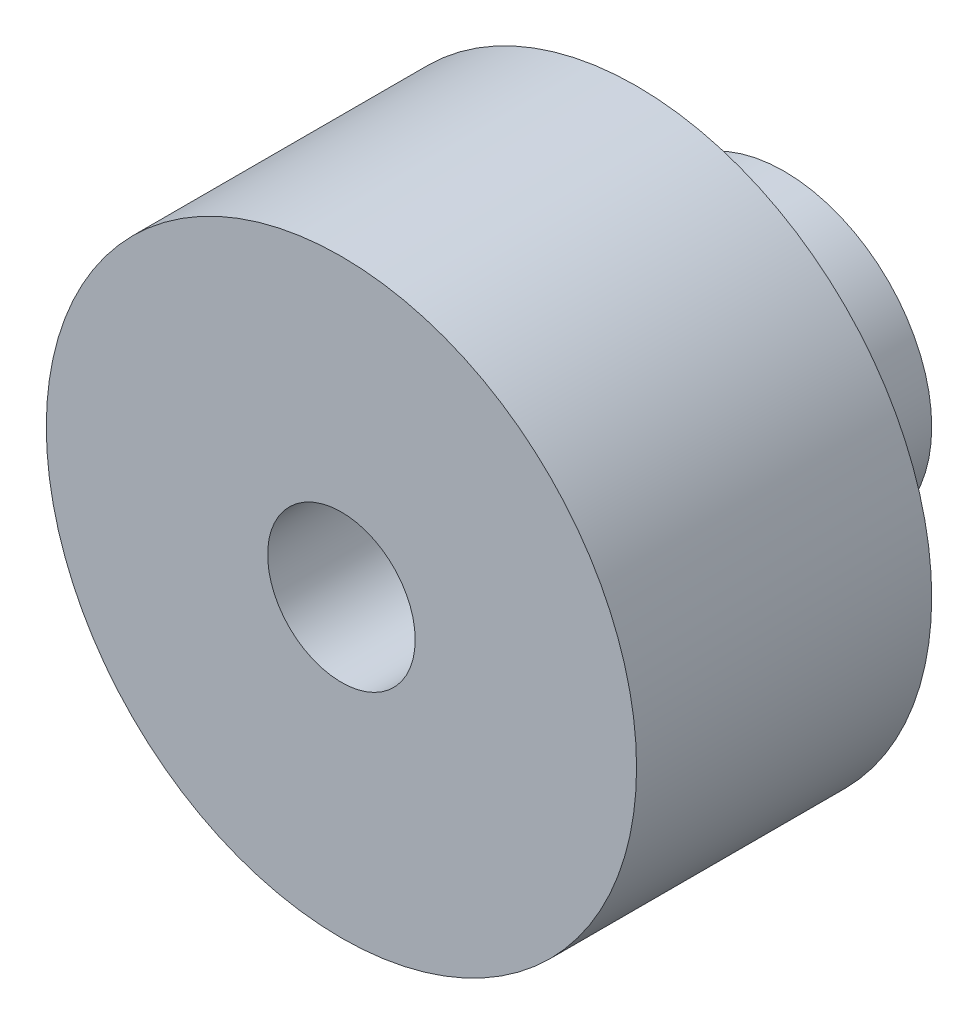
ISO-10303-21;
HEADER;
FILE_DESCRIPTION(('STEP AP214'),'2;1');
FILE_NAME('part.step','',(''),(''),'','','');
FILE_SCHEMA(('AUTOMOTIVE_DESIGN { 1 0 10303 214 1 1 1 1 }'));
ENDSEC;
DATA;
#1=APPLICATION_CONTEXT('core data for automotive mechanical design processes');
#2=APPLICATION_PROTOCOL_DEFINITION('international standard','automotive_design',2000,#1);
#3=PRODUCT_CONTEXT('',#1,'mechanical');
#4=PRODUCT('Part','Part','',(#3));
#5=PRODUCT_RELATED_PRODUCT_CATEGORY('part','',(#4));
#6=PRODUCT_DEFINITION_FORMATION('','',#4);
#7=PRODUCT_DEFINITION_CONTEXT('part definition',#1,'design');
#8=PRODUCT_DEFINITION('design','',#6,#7);
#9=PRODUCT_DEFINITION_SHAPE('','',#8);
#10=(LENGTH_UNIT() NAMED_UNIT(*) SI_UNIT(.MILLI.,.METRE.));
#11=(NAMED_UNIT(*) PLANE_ANGLE_UNIT() SI_UNIT($,.RADIAN.));
#12=(NAMED_UNIT(*) SI_UNIT($,.STERADIAN.) SOLID_ANGLE_UNIT());
#13=UNCERTAINTY_MEASURE_WITH_UNIT(LENGTH_MEASURE(1.E-05),#10,'distance_accuracy_value','');
#14=(GEOMETRIC_REPRESENTATION_CONTEXT(3) GLOBAL_UNCERTAINTY_ASSIGNED_CONTEXT((#13)) GLOBAL_UNIT_ASSIGNED_CONTEXT((#10,
#11,#12)) REPRESENTATION_CONTEXT('',''));
#15=CARTESIAN_POINT('',(0.,0.,0.));
#16=DIRECTION('',(0.,0.,1.));
#17=DIRECTION('',(1.,0.,0.));
#18=AXIS2_PLACEMENT_3D('',#15,#16,#17);
#19=CARTESIAN_POINT('',(0.,0.,0.));
#20=DIRECTION('',(0.,0.,1.));
#21=DIRECTION('',(1.,0.,0.));
#22=AXIS2_PLACEMENT_3D('',#19,#20,#21);
#23=PLANE('',#22);
#24=CARTESIAN_POINT('',(0.,0.,0.));
#25=DIRECTION('',(0.,0.,1.));
#26=DIRECTION('',(1.,0.,0.));
#27=AXIS2_PLACEMENT_3D('',#24,#25,#26);
#28=CIRCLE('',#27,20.);
#29=CARTESIAN_POINT('',(20.,0.,0.));
#30=VERTEX_POINT('',#29);
#31=EDGE_CURVE('E66',#30,#30,#28,.T.);
#32=ORIENTED_EDGE('',*,*,#31,.F.);
#33=EDGE_LOOP('',(#32));
#34=FACE_BOUND('',#33,.T.);
#35=CARTESIAN_POINT('',(0.,0.,0.));
#36=DIRECTION('',(0.,0.,1.));
#37=DIRECTION('',(1.,0.,0.));
#38=AXIS2_PLACEMENT_3D('',#35,#36,#37);
#39=CIRCLE('',#38,10.);
#40=CARTESIAN_POINT('',(10.,0.,0.));
#41=VERTEX_POINT('',#40);
#42=EDGE_CURVE('E56',#41,#41,#39,.F.);
#43=ORIENTED_EDGE('',*,*,#42,.F.);
#44=EDGE_LOOP('',(#43));
#45=FACE_BOUND('',#44,.T.);
#46=ADVANCED_FACE('F43',(#34,#45),#23,.F.);
#47=CARTESIAN_POINT('',(0.,0.,20.));
#48=DIRECTION('',(0.,0.,-1.));
#49=DIRECTION('',(-1.,0.,0.));
#50=AXIS2_PLACEMENT_3D('',#47,#48,#49);
#51=CYLINDRICAL_SURFACE('',#50,20.);
#52=CARTESIAN_POINT('',(0.,0.,20.));
#53=DIRECTION('',(0.,0.,1.));
#54=DIRECTION('',(1.,0.,0.));
#55=AXIS2_PLACEMENT_3D('',#52,#53,#54);
#56=CIRCLE('',#55,20.);
#57=CARTESIAN_POINT('',(20.,0.,20.));
#58=VERTEX_POINT('',#57);
#59=EDGE_CURVE('E61',#58,#58,#56,.T.);
#60=ORIENTED_EDGE('',*,*,#59,.F.);
#61=EDGE_LOOP('',(#60));
#62=FACE_BOUND('',#61,.T.);
#63=ORIENTED_EDGE('',*,*,#31,.T.);
#64=EDGE_LOOP('',(#63));
#65=FACE_BOUND('',#64,.T.);
#66=ADVANCED_FACE('F45',(#62,#65),#51,.T.);
#67=CARTESIAN_POINT('',(0.,0.,20.));
#68=DIRECTION('',(0.,0.,1.));
#69=DIRECTION('',(1.,0.,0.));
#70=AXIS2_PLACEMENT_3D('',#67,#68,#69);
#71=PLANE('',#70);
#72=CARTESIAN_POINT('',(0.,0.,20.));
#73=DIRECTION('',(0.,0.,1.));
#74=DIRECTION('',(1.,0.,0.));
#75=AXIS2_PLACEMENT_3D('',#72,#73,#74);
#76=CIRCLE('',#75,5.);
#77=CARTESIAN_POINT('',(5.,0.,20.));
#78=VERTEX_POINT('',#77);
#79=EDGE_CURVE('E71',#78,#78,#76,.T.);
#80=ORIENTED_EDGE('',*,*,#79,.F.);
#81=EDGE_LOOP('',(#80));
#82=FACE_BOUND('',#81,.T.);
#83=ORIENTED_EDGE('',*,*,#59,.T.);
#84=EDGE_LOOP('',(#83));
#85=FACE_BOUND('',#84,.T.);
#86=ADVANCED_FACE('F108',(#82,#85),#71,.T.);
#87=CARTESIAN_POINT('',(0.,0.,-14.142135623731));
#88=DIRECTION('',(0.,0.,1.));
#89=DIRECTION('',(1.,0.,0.));
#90=AXIS2_PLACEMENT_3D('',#87,#88,#89);
#91=CYLINDRICAL_SURFACE('',#90,5.);
#92=CARTESIAN_POINT('',(5.,0.,-6.));
#93=CARTESIAN_POINT('',(4.99999897580871,-0.0555769067926332,-5.99999795550166));
#94=CARTESIAN_POINT('',(4.99906385178231,-0.111179660201522,-5.99535115703235));
#95=CARTESIAN_POINT('',(4.99542365623231,-0.220813507689019,-5.97690149988475));
#96=CARTESIAN_POINT('',(4.99271717860186,-0.274843317541356,-5.96309136719849));
#97=CARTESIAN_POINT('',(4.98583649278287,-0.379730305263313,-5.92675872637921));
#98=CARTESIAN_POINT('',(4.98166369076718,-0.430590467933134,-5.90424456315531));
#99=CARTESIAN_POINT('',(4.97230398035314,-0.527807988864226,-5.85116775248871));
#100=CARTESIAN_POINT('',(4.96711713235707,-0.574165615075812,-5.82060558439279));
#101=CARTESIAN_POINT('',(4.9562216532997,-0.661693477314865,-5.75186150570857));
#102=CARTESIAN_POINT('',(4.95050745504347,-0.702793951158525,-5.7135916446088));
#103=CARTESIAN_POINT('',(4.93924180452588,-0.778036756608028,-5.6307075836083));
#104=CARTESIAN_POINT('',(4.93369036500424,-0.812178544770425,-5.58609288866488));
#105=CARTESIAN_POINT('',(4.92332441812615,-0.87283175334762,-5.49128380698812));
#106=CARTESIAN_POINT('',(4.91851707364946,-0.899270938865866,-5.44104235620364));
#107=CARTESIAN_POINT('',(4.91026268058418,-0.943305666580308,-5.33671818099592));
#108=CARTESIAN_POINT('',(4.90681549761962,-0.960902082437238,-5.28263583665365));
#109=CARTESIAN_POINT('',(4.90172805252204,-0.986525299884827,-5.17291563609208));
#110=CARTESIAN_POINT('',(4.90006470107188,-0.994674497958777,-5.11730745585777));
#111=CARTESIAN_POINT('',(4.89866375060627,-1.00155212772612,-5.00549017863566));
#112=CARTESIAN_POINT('',(4.89892595467841,-1.0002815227135,-4.94928114367985));
#113=CARTESIAN_POINT('',(4.90132551148185,-0.988454573101819,-4.838753211979));
#114=CARTESIAN_POINT('',(4.90343452858763,-0.978038540243905,-4.78441859437269));
#115=CARTESIAN_POINT('',(4.90924546160001,-0.94843788462305,-4.678283923337));
#116=CARTESIAN_POINT('',(4.91294745357779,-0.929252843100681,-4.62648399108099));
#117=CARTESIAN_POINT('',(4.92155618500408,-0.882524783674719,-4.5264847382964));
#118=CARTESIAN_POINT('',(4.92647089813704,-0.854926151232114,-4.47831212043083));
#119=CARTESIAN_POINT('',(4.93694618773062,-0.792193574572679,-4.38722915002719));
#120=CARTESIAN_POINT('',(4.94250683838366,-0.757058764356829,-4.34431940314884));
#121=CARTESIAN_POINT('',(4.95377021241462,-0.679499934560584,-4.26417059754306));
#122=CARTESIAN_POINT('',(4.95947369210905,-0.636956161212445,-4.22704743214087));
#123=CARTESIAN_POINT('',(4.97028848714408,-0.54618502406201,-4.16044615369878));
#124=CARTESIAN_POINT('',(4.97539979488974,-0.497957587379389,-4.13096813870642));
#125=CARTESIAN_POINT('',(4.98446690160887,-0.397059386878921,-4.08047249077403));
#126=CARTESIAN_POINT('',(4.98842088848272,-0.3443818195853,-4.05946810635546));
#127=CARTESIAN_POINT('',(4.99471408987858,-0.236148976448665,-4.02663952596143));
#128=CARTESIAN_POINT('',(4.99705350000531,-0.18059405007245,-4.01481421792637));
#129=CARTESIAN_POINT('',(4.99982671866868,-0.0691794056271504,-4.00084354620572));
#130=CARTESIAN_POINT('',(5.0002917465247,-0.0133403283255762,-3.99853958045973));
#131=CARTESIAN_POINT('',(4.99935051930103,0.0979249341927141,-4.00324985894218));
#132=CARTESIAN_POINT('',(4.99794436941446,0.153351142443793,-4.0102635793526));
#133=CARTESIAN_POINT('',(4.99343832008018,0.261705659946541,-4.03327837354396));
#134=CARTESIAN_POINT('',(4.99035376404206,0.314651948339903,-4.0491980684979));
#135=CARTESIAN_POINT('',(4.98283552061033,0.417123627499667,-4.08948398265581));
#136=CARTESIAN_POINT('',(4.97840173214227,0.466648761637539,-4.11385083467683));
#137=CARTESIAN_POINT('',(4.96859911533294,0.561541173686218,-4.17068249065131));
#138=CARTESIAN_POINT('',(4.96321950437052,0.606850126752188,-4.20324278103895));
#139=CARTESIAN_POINT('',(4.95214734829882,0.691418019119206,-4.27540919120728));
#140=CARTESIAN_POINT('',(4.94645476968388,0.730676308930762,-4.31501606639987));
#141=CARTESIAN_POINT('',(4.93529303556965,0.802640590774176,-4.40087335189112));
#142=CARTESIAN_POINT('',(4.92982860233304,0.835237702448655,-4.44721574422134));
#143=CARTESIAN_POINT('',(4.91984191796194,0.892185420051205,-4.54481136135668));
#144=CARTESIAN_POINT('',(4.91531962913342,0.916536355922903,-4.59606438957355));
#145=CARTESIAN_POINT('',(4.90776740584383,0.95615184158196,-4.70176824614955));
#146=CARTESIAN_POINT('',(4.90472974872187,0.971463499791051,-4.75620084121032));
#147=CARTESIAN_POINT('',(4.90047436792025,0.992708651627196,-4.86693345349091));
#148=CARTESIAN_POINT('',(4.89925640691111,0.998643368225112,-4.92323322620935));
#149=CARTESIAN_POINT('',(4.89879149631379,1.00092091086747,-5.03500886454432));
#150=CARTESIAN_POINT('',(4.89950919189301,0.997435788070896,-5.09048114892701));
#151=CARTESIAN_POINT('',(4.90275573484614,0.981352304100061,-5.20003164990503));
#152=CARTESIAN_POINT('',(4.90528456767169,0.968754016129298,-5.2541098776948));
#153=CARTESIAN_POINT('',(4.91185264219159,0.934878568498954,-5.35922771124055));
#154=CARTESIAN_POINT('',(4.91588821018831,0.913622506717344,-5.41027436050242));
#155=CARTESIAN_POINT('',(4.9250171497417,0.863054644601604,-5.50810372073444));
#156=CARTESIAN_POINT('',(4.93011060998894,0.833742168774882,-5.55488607372514));
#157=CARTESIAN_POINT('',(4.94088960523225,0.767305914786414,-5.64371557215031));
#158=CARTESIAN_POINT('',(4.94658372909699,0.73005788723518,-5.6856687652676));
#159=CARTESIAN_POINT('',(4.95786081871955,0.64906436901314,-5.76278620552917));
#160=CARTESIAN_POINT('',(4.96344375863184,0.605317387153334,-5.79794889031727));
#161=CARTESIAN_POINT('',(4.97393832387971,0.512017629088246,-5.86083464394645));
#162=CARTESIAN_POINT('',(4.97884231219246,0.462408884429835,-5.88847600328002));
#163=CARTESIAN_POINT('',(4.98735125085,0.359166360940732,-5.93498612259659));
#164=CARTESIAN_POINT('',(4.99095737138616,0.305536260863126,-5.95386278953249));
#165=CARTESIAN_POINT('',(4.99576372595371,0.209821488923779,-5.97865194804472));
#166=CARTESIAN_POINT('',(4.99734303158452,0.168281664013784,-5.98664319370776));
#167=CARTESIAN_POINT('',(4.99946154139893,0.0844995252100669,-5.99731791235836));
#168=CARTESIAN_POINT('',(5.00000077873155,0.042257233748619,-6.00000155450977));
#169=CARTESIAN_POINT('',(5.,0.,-6.));
#170=B_SPLINE_CURVE_WITH_KNOTS('',3,(#92,#93,#94,#95,#96,#97,#98,#99,#100,#101,#102,#103,#104,
#105,#106,#107,#108,#109,#110,#111,#112,#113,#114,#115,#116,#117,#118,#119,#120,#121,#122,#123,
#124,#125,#126,#127,#128,#129,#130,#131,#132,#133,#134,#135,#136,#137,#138,#139,#140,#141,#142,
#143,#144,#145,#146,#147,#148,#149,#150,#151,#152,#153,#154,#155,#156,#157,#158,#159,#160,#161,
#162,#163,#164,#165,#166,#167,#168,#169),.UNSPECIFIED.,.T.,.F.,(4,2,2,2,2,2,2,2,2,2,2,2,2,2,2,2,
2,2,2,2,2,2,2,2,2,2,2,2,2,2,2,2,2,2,2,2,2,2,4),(0.,0.166576130661258,0.333284650691323,
0.499833735250342,0.666372902230863,0.834932670112187,1.00350559674737,1.17361195005923,
1.34370149365197,1.51156185103587,1.67940504281225,1.84471727006278,2.0100373925373,
2.17647490203592,2.3429315474967,2.51238252491351,2.6818356753982,2.85155274854024,
3.02124925698036,3.18810735676265,3.35495607657867,3.52030453950723,3.68566539216022,
3.85305066033358,4.0204538834593,4.19040628579226,4.36035188723466,4.52940381032723,
4.69843368330415,4.86439722567701,5.03035943492608,5.1959196125311,5.36149367581866,
5.52988076239143,5.6983065453293,5.86849496675637,6.03852955517518,6.16518775289894,
6.29184191370996),.UNSPECIFIED.);
#171=CARTESIAN_POINT('',(5.,0.,-6.));
#172=VERTEX_POINT('',#171);
#173=EDGE_CURVE('E84',#172,#172,#170,.T.);
#174=ORIENTED_EDGE('',*,*,#173,.F.);
#175=EDGE_LOOP('',(#174));
#176=FACE_BOUND('',#175,.T.);
#177=ORIENTED_EDGE('',*,*,#79,.T.);
#178=EDGE_LOOP('',(#177));
#179=FACE_BOUND('',#178,.T.);
#180=CARTESIAN_POINT('',(0.,0.,-10.));
#181=DIRECTION('',(0.,0.,-1.));
#182=DIRECTION('',(-1.,0.,0.));
#183=AXIS2_PLACEMENT_3D('',#180,#181,#182);
#184=CIRCLE('',#183,5.);
#185=CARTESIAN_POINT('',(-5.,0.,-10.));
#186=VERTEX_POINT('',#185);
#187=EDGE_CURVE('E80',#186,#186,#184,.T.);
#188=ORIENTED_EDGE('',*,*,#187,.T.);
#189=EDGE_LOOP('',(#188));
#190=FACE_BOUND('',#189,.T.);
#191=ADVANCED_FACE('F101',(#176,#179,#190),#91,.F.);
#192=CARTESIAN_POINT('',(0.,0.,-10.));
#193=DIRECTION('',(0.,0.,-1.));
#194=DIRECTION('',(-1.,0.,0.));
#195=AXIS2_PLACEMENT_3D('',#192,#193,#194);
#196=PLANE('',#195);
#197=CARTESIAN_POINT('',(0.,0.,-10.));
#198=DIRECTION('',(0.,0.,-1.));
#199=DIRECTION('',(-1.,0.,0.));
#200=AXIS2_PLACEMENT_3D('',#197,#198,#199);
#201=CIRCLE('',#200,10.);
#202=CARTESIAN_POINT('',(-10.,0.,-10.));
#203=VERTEX_POINT('',#202);
#204=EDGE_CURVE('E76',#203,#203,#201,.T.);
#205=ORIENTED_EDGE('',*,*,#204,.T.);
#206=EDGE_LOOP('',(#205));
#207=FACE_BOUND('',#206,.T.);
#208=ORIENTED_EDGE('',*,*,#187,.F.);
#209=EDGE_LOOP('',(#208));
#210=FACE_BOUND('',#209,.T.);
#211=ADVANCED_FACE('F98',(#207,#210),#196,.T.);
#212=CARTESIAN_POINT('',(0.,0.,-10.));
#213=DIRECTION('',(0.,0.,1.));
#214=DIRECTION('',(1.,0.,0.));
#215=AXIS2_PLACEMENT_3D('',#212,#213,#214);
#216=CYLINDRICAL_SURFACE('',#215,10.);
#217=CARTESIAN_POINT('',(10.,0.,-6.));
#218=CARTESIAN_POINT('',(9.9999993552077,-0.0560203537915572,-5.99999757409962));
#219=CARTESIAN_POINT('',(9.99952425596206,-0.112077745167773,-5.99527673110356));
#220=CARTESIAN_POINT('',(9.99767467594738,-0.222638398496837,-5.97651562970957));
#221=CARTESIAN_POINT('',(9.99629920434026,-0.277139879168828,-5.96246510397541));
#222=CARTESIAN_POINT('',(9.9928041456307,-0.382971675453414,-5.92545775940217));
#223=CARTESIAN_POINT('',(9.99068500800708,-0.434303884614909,-5.90250631948153));
#224=CARTESIAN_POINT('',(9.98593957394306,-0.532376160960406,-5.84835909206836));
#225=CARTESIAN_POINT('',(9.98331337838132,-0.579117138779076,-5.81716494399986));
#226=CARTESIAN_POINT('',(9.97783744341324,-0.666859550674082,-5.74729730233773));
#227=CARTESIAN_POINT('',(9.97498701573866,-0.707842144834892,-5.70860020059797));
#228=CARTESIAN_POINT('',(9.96938956906262,-0.782742521430984,-5.62487546573697));
#229=CARTESIAN_POINT('',(9.96664255484917,-0.816659977082653,-5.57984753995761));
#230=CARTESIAN_POINT('',(9.96155591552784,-0.876533970443616,-5.48462146831638));
#231=CARTESIAN_POINT('',(9.95921716710905,-0.902473465454879,-5.43441255590514));
#232=CARTESIAN_POINT('',(9.95522037546525,-0.94554638474276,-5.33032441409502));
#233=CARTESIAN_POINT('',(9.95356231542222,-0.962680026591291,-5.27644527541605));
#234=CARTESIAN_POINT('',(9.95112084072978,-0.987599041601893,-5.16673819913399));
#235=CARTESIAN_POINT('',(9.95033450398096,-0.995415653003795,-5.11091742314779));
#236=CARTESIAN_POINT('',(9.94971643060525,-1.00157528513536,-4.99875113660422));
#237=CARTESIAN_POINT('',(9.94988466888746,-0.999918554870801,-4.94240563987794));
#238=CARTESIAN_POINT('',(9.95115406898935,-0.987204280252678,-4.83100469030668));
#239=CARTESIAN_POINT('',(9.95225184590651,-0.976180844124552,-4.7759453006713));
#240=CARTESIAN_POINT('',(9.95525134287419,-0.945099144150586,-4.66846203679891));
#241=CARTESIAN_POINT('',(9.95715307378492,-0.925040758255746,-4.61603819817497));
#242=CARTESIAN_POINT('',(9.9615500945207,-0.876420893881507,-4.51520641270111));
#243=CARTESIAN_POINT('',(9.96404643908157,-0.847844282719979,-4.46680581051068));
#244=CARTESIAN_POINT('',(9.96935051732879,-0.783010027353227,-4.37547478508812));
#245=CARTESIAN_POINT('',(9.97215826012784,-0.746752158336505,-4.33254452201824));
#246=CARTESIAN_POINT('',(9.97778385312989,-0.667394112412069,-4.25317460601097));
#247=CARTESIAN_POINT('',(9.98060169332997,-0.624264478851363,-4.21676439811919));
#248=CARTESIAN_POINT('',(9.98591829078518,-0.532489481737112,-4.15169636708961));
#249=CARTESIAN_POINT('',(9.98841704768256,-0.483844111999601,-4.12303855264352));
#250=CARTESIAN_POINT('',(9.99281475667096,-0.382398105692364,-4.07428997968975));
#251=CARTESIAN_POINT('',(9.99471360414769,-0.329596746389903,-4.05420071518194));
#252=CARTESIAN_POINT('',(9.99769647441408,-0.221347217329932,-4.02318108328825));
#253=CARTESIAN_POINT('',(9.99878052157063,-0.1658991267766,-4.01225044200938));
#254=CARTESIAN_POINT('',(10.0000085166831,-0.0541850990919039,-3.99989569226524));
#255=CARTESIAN_POINT('',(10.0001564826774,0.00207630210549181,-3.9984309517475));
#256=CARTESIAN_POINT('',(9.99950641756797,0.1140437933157,-4.00494286304876));
#257=CARTESIAN_POINT('',(9.99870839924468,0.16974989082047,-4.01291938731528));
#258=CARTESIAN_POINT('',(9.99625861539194,0.278908206834674,-4.03805369542158));
#259=CARTESIAN_POINT('',(9.99460861918039,0.332364848972019,-4.05519245447801));
#260=CARTESIAN_POINT('',(9.99063998860609,0.435644321383781,-4.09814517403727));
#261=CARTESIAN_POINT('',(9.98832133925254,0.485467070157117,-4.1239593290394));
#262=CARTESIAN_POINT('',(9.98326475330422,0.580248180172142,-4.18363083866391));
#263=CARTESIAN_POINT('',(9.98052543603441,0.625189659748917,-4.21751488892582));
#264=CARTESIAN_POINT('',(9.9749393286952,0.708761623311878,-4.29232606774093));
#265=CARTESIAN_POINT('',(9.97209253592971,0.747391948849177,-4.33325337307032));
#266=CARTESIAN_POINT('',(9.96660024140755,0.817386109887145,-4.421166574659));
#267=CARTESIAN_POINT('',(9.96395550138975,0.848723278679543,-4.46817375654262));
#268=CARTESIAN_POINT('',(9.9591783246089,0.903058258743827,-4.56680736014669));
#269=CARTESIAN_POINT('',(9.95704588084038,0.926056184053882,-4.6184337186884));
#270=CARTESIAN_POINT('',(9.95353947634049,0.963015208684475,-4.72474873946579));
#271=CARTESIAN_POINT('',(9.95216418449789,0.976992174811861,-4.77943184009112));
#272=CARTESIAN_POINT('',(9.95032365282877,0.995564007129462,-4.89038319796077));
#273=CARTESIAN_POINT('',(9.94985838690186,1.00015914239952,-4.94665140969567));
#274=CARTESIAN_POINT('',(9.94989113107562,0.999833138471256,-5.0589106883567));
#275=CARTESIAN_POINT('',(9.95038490087009,0.994953889593112,-5.11490188288281));
#276=CARTESIAN_POINT('',(9.95227103889546,0.975905452963652,-5.22526491716829));
#277=CARTESIAN_POINT('',(9.95366340813718,0.96173625476216,-5.27963675510598));
#278=CARTESIAN_POINT('',(9.95718868263187,0.924521686297503,-5.38521734904786));
#279=CARTESIAN_POINT('',(9.95932148540361,0.901477544340916,-5.43642654162972));
#280=CARTESIAN_POINT('',(9.96408751839359,0.847171554911043,-5.53425689167103));
#281=CARTESIAN_POINT('',(9.96672074580951,0.815909753455414,-5.58087807482063));
#282=CARTESIAN_POINT('',(9.97220487209698,0.745898556285331,-5.66842367447194));
#283=CARTESIAN_POINT('',(9.97505664726751,0.707117948890268,-5.70932307636709));
#284=CARTESIAN_POINT('',(9.98064854728783,0.623231699225109,-5.78405223269966));
#285=CARTESIAN_POINT('',(9.98338864522976,0.578124544108257,-5.81788029135717));
#286=CARTESIAN_POINT('',(9.98845562069162,0.482741434161289,-5.87757345385462));
#287=CARTESIAN_POINT('',(9.99078144026812,0.432452749346764,-5.90341829094518));
#288=CARTESIAN_POINT('',(9.99474629249896,0.328258279100551,-5.94626242282387));
#289=CARTESIAN_POINT('',(9.99638609909654,0.274356649825609,-5.96327169095355));
#290=CARTESIAN_POINT('',(9.99838213773734,0.183458261405704,-5.9837206170848));
#291=CARTESIAN_POINT('',(9.99898600691833,0.147042552844509,-5.98981704429936));
#292=CARTESIAN_POINT('',(9.99979514950786,0.073756580817313,-5.99795752606176));
#293=CARTESIAN_POINT('',(10.0000004245602,0.0368863192265578,-6.00000159732186));
#294=CARTESIAN_POINT('',(10.,0.,-6.));
#295=B_SPLINE_CURVE_WITH_KNOTS('',3,(#217,#218,#219,#220,#221,#222,#223,#224,#225,#226,#227,
#228,#229,#230,#231,#232,#233,#234,#235,#236,#237,#238,#239,#240,#241,#242,#243,#244,#245,#246,
#247,#248,#249,#250,#251,#252,#253,#254,#255,#256,#257,#258,#259,#260,#261,#262,#263,#264,#265,
#266,#267,#268,#269,#270,#271,#272,#273,#274,#275,#276,#277,#278,#279,#280,#281,#282,#283,#284,
#285,#286,#287,#288,#289,#290,#291,#292,#293,#294),.UNSPECIFIED.,.T.,.F.,(4,2,2,2,2,2,2,2,2,2,2,
2,2,2,2,2,2,2,2,2,2,2,2,2,2,2,2,2,2,2,2,2,2,2,2,2,2,2,4),(0.,0.167926366268474,
0.336037842835486,0.504047885732201,0.672024537582782,0.840538568622945,1.00906039220706,
1.17793975472222,1.34681494442504,1.51512232045197,1.68342527255777,1.85111797441111,
2.01881294161634,2.18680761372895,2.35480720331125,2.52354734196206,2.69228766979772,
2.86105740693581,3.02982209675439,3.19786188607758,3.36589940519143,3.53358935294305,
3.70128306049467,3.86953940748698,4.0377999781023,4.20666643608598,4.37553058475374,
4.54409690593003,4.71265839239585,4.88047629293956,5.04829438226039,5.216089253628,
5.3838831853896,5.55238917427653,5.72093552636958,5.88990631026242,6.05868594795295,
6.16925667232348,6.27982694069027),.UNSPECIFIED.);
#296=CARTESIAN_POINT('',(10.,0.,-6.));
#297=VERTEX_POINT('',#296);
#298=EDGE_CURVE('E10',#297,#297,#295,.T.);
#299=ORIENTED_EDGE('',*,*,#298,.T.);
#300=EDGE_LOOP('',(#299));
#301=FACE_BOUND('',#300,.T.);
#302=ORIENTED_EDGE('',*,*,#204,.F.);
#303=EDGE_LOOP('',(#302));
#304=FACE_BOUND('',#303,.T.);
#305=ORIENTED_EDGE('',*,*,#42,.T.);
#306=EDGE_LOOP('',(#305));
#307=FACE_BOUND('',#306,.T.);
#308=ADVANCED_FACE('F96',(#301,#304,#307),#216,.T.);
#309=CARTESIAN_POINT('',(-20.001,0.,-5.));
#310=DIRECTION('',(1.,0.,0.));
#311=DIRECTION('',(0.,0.,-1.));
#312=AXIS2_PLACEMENT_3D('',#309,#310,#311);
#313=CYLINDRICAL_SURFACE('',#312,1.);
#314=ORIENTED_EDGE('',*,*,#173,.T.);
#315=EDGE_LOOP('',(#314));
#316=FACE_BOUND('',#315,.T.);
#317=ORIENTED_EDGE('',*,*,#298,.F.);
#318=EDGE_LOOP('',(#317));
#319=FACE_BOUND('',#318,.T.);
#320=ADVANCED_FACE('F91',(#316,#319),#313,.F.);
#321=CLOSED_SHELL('',(#46,#66,#86,#191,#211,#308,#320));
#322=MANIFOLD_SOLID_BREP('B2',#321);
#323=ADVANCED_BREP_SHAPE_REPRESENTATION('',(#18,#322),#14);
#324=SHAPE_DEFINITION_REPRESENTATION(#9,#323);
ENDSEC;
END-ISO-10303-21;
